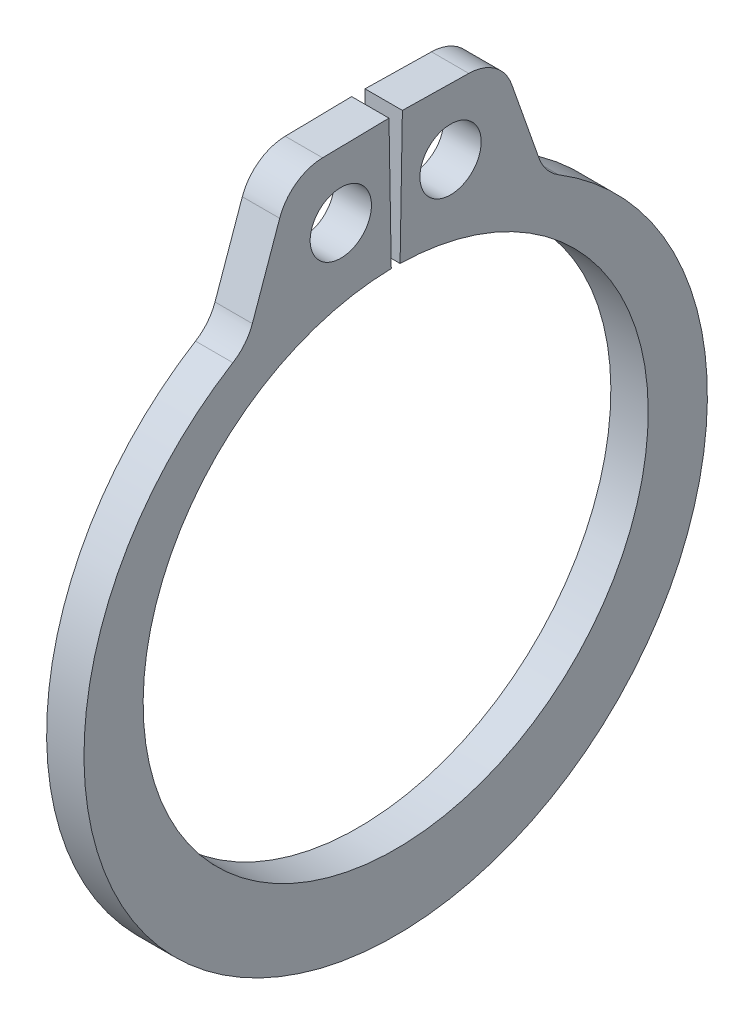
ISO-10303-21;
HEADER;
FILE_DESCRIPTION(('STEP AP214'),'2;1');
FILE_NAME('part.step','',(''),(''),'','','');
FILE_SCHEMA(('AUTOMOTIVE_DESIGN { 1 0 10303 214 1 1 1 1 }'));
ENDSEC;
DATA;
#1=APPLICATION_CONTEXT('core data for automotive mechanical design processes');
#2=APPLICATION_PROTOCOL_DEFINITION('international standard','automotive_design',2000,#1);
#3=PRODUCT_CONTEXT('',#1,'mechanical');
#4=PRODUCT('Part','Part','',(#3));
#5=PRODUCT_RELATED_PRODUCT_CATEGORY('part','',(#4));
#6=PRODUCT_DEFINITION_FORMATION('','',#4);
#7=PRODUCT_DEFINITION_CONTEXT('part definition',#1,'design');
#8=PRODUCT_DEFINITION('design','',#6,#7);
#9=PRODUCT_DEFINITION_SHAPE('','',#8);
#10=(LENGTH_UNIT() NAMED_UNIT(*) SI_UNIT(.MILLI.,.METRE.));
#11=(NAMED_UNIT(*) PLANE_ANGLE_UNIT() SI_UNIT($,.RADIAN.));
#12=(NAMED_UNIT(*) SI_UNIT($,.STERADIAN.) SOLID_ANGLE_UNIT());
#13=UNCERTAINTY_MEASURE_WITH_UNIT(LENGTH_MEASURE(1.E-05),#10,'distance_accuracy_value','');
#14=(GEOMETRIC_REPRESENTATION_CONTEXT(3) GLOBAL_UNCERTAINTY_ASSIGNED_CONTEXT((#13)) GLOBAL_UNIT_ASSIGNED_CONTEXT((#10,
#11,#12)) REPRESENTATION_CONTEXT('',''));
#15=CARTESIAN_POINT('',(0.,0.,0.));
#16=DIRECTION('',(0.,0.,1.));
#17=DIRECTION('',(1.,0.,0.));
#18=AXIS2_PLACEMENT_3D('',#15,#16,#17);
#19=CARTESIAN_POINT('',(0.3175,0.,0.));
#20=DIRECTION('',(1.,0.,0.));
#21=DIRECTION('',(0.,0.,-1.));
#22=AXIS2_PLACEMENT_3D('',#19,#20,#21);
#23=PLANE('',#22);
#24=CARTESIAN_POINT('',(0.3175,5.39474739325939,0.932493347387091));
#25=DIRECTION('',(1.,0.,0.));
#26=DIRECTION('',(0.,0.,-1.));
#27=AXIS2_PLACEMENT_3D('',#24,#25,#26);
#28=CIRCLE('',#27,0.5207);
#29=CARTESIAN_POINT('',(0.3175,5.39474739325939,0.411793347387091));
#30=VERTEX_POINT('',#29);
#31=EDGE_CURVE('E221',#30,#30,#28,.T.);
#32=ORIENTED_EDGE('',*,*,#31,.F.);
#33=EDGE_LOOP('',(#32));
#34=FACE_BOUND('',#33,.T.);
#35=DIRECTION('',(0.,-0.0174524064372937,0.999847695156391));
#36=VECTOR('',#35,1.);
#37=CARTESIAN_POINT('',(0.3175,6.5268057844419,0.1139258187413));
#38=LINE('',#37,#36);
#39=CARTESIAN_POINT('',(0.3175,6.5268057844419,0.1139258187413));
#40=VERTEX_POINT('',#39);
#41=CARTESIAN_POINT('',(0.3175,6.50710052961542,1.24283911167381));
#42=VERTEX_POINT('',#41);
#43=EDGE_CURVE('E133',#40,#42,#38,.T.);
#44=ORIENTED_EDGE('',*,*,#43,.T.);
#45=CARTESIAN_POINT('',(0.3175,5.71982045444928,1.22909708684509));
#46=DIRECTION('',(1.,0.,0.));
#47=DIRECTION('',(0.,0.,-1.));
#48=AXIS2_PLACEMENT_3D('',#45,#46,#47);
#49=CIRCLE('',#48,0.7874);
#50=CARTESIAN_POINT('',(0.3175,5.98129100900125,1.97181635352819));
#51=VERTEX_POINT('',#50);
#52=EDGE_CURVE('E174',#42,#51,#49,.T.);
#53=ORIENTED_EDGE('',*,*,#52,.T.);
#54=DIRECTION('',(0.,-0.94325535519825,0.332068268417539));
#55=VECTOR('',#54,1.);
#56=CARTESIAN_POINT('',(0.3175,6.49754857029042,1.79007049490147));
#57=LINE('',#56,#55);
#58=CARTESIAN_POINT('',(0.3175,4.66344515220105,2.4357573100223));
#59=VERTEX_POINT('',#58);
#60=EDGE_CURVE('E213',#51,#59,#57,.T.);
#61=ORIENTED_EDGE('',*,*,#60,.T.);
#62=CARTESIAN_POINT('',(0.3175,4.92491570675302,3.17847657670541));
#63=DIRECTION('',(1.,0.,0.));
#64=DIRECTION('',(0.,0.,-1.));
#65=AXIS2_PLACEMENT_3D('',#62,#63,#64);
#66=CIRCLE('',#65,0.7874);
#67=CARTESIAN_POINT('',(0.3175,4.25345366496523,2.76721329553605));
#68=VERTEX_POINT('',#67);
#69=EDGE_CURVE('E181',#59,#68,#66,.F.);
#70=ORIENTED_EDGE('',*,*,#69,.T.);
#71=CARTESIAN_POINT('',(0.3175,-0.26452490146511,0.));
#72=DIRECTION('',(1.,0.,0.));
#73=DIRECTION('',(0.,0.,-1.));
#74=AXIS2_PLACEMENT_3D('',#71,#72,#73);
#75=CIRCLE('',#74,5.29807509853489);
#76=CARTESIAN_POINT('',(0.3175,4.25345366496523,-2.76721329553605));
#77=VERTEX_POINT('',#76);
#78=EDGE_CURVE('E206',#68,#77,#75,.T.);
#79=ORIENTED_EDGE('',*,*,#78,.T.);
#80=CARTESIAN_POINT('',(0.3175,4.92491570675302,-3.17847657670541));
#81=DIRECTION('',(1.,0.,0.));
#82=DIRECTION('',(0.,0.,-1.));
#83=AXIS2_PLACEMENT_3D('',#80,#81,#82);
#84=CIRCLE('',#83,0.7874);
#85=CARTESIAN_POINT('',(0.3175,4.66344515220105,-2.4357573100223));
#86=VERTEX_POINT('',#85);
#87=EDGE_CURVE('E11',#77,#86,#84,.F.);
#88=ORIENTED_EDGE('',*,*,#87,.T.);
#89=DIRECTION('',(0.,0.94325535519825,0.332068268417539));
#90=VECTOR('',#89,1.);
#91=CARTESIAN_POINT('',(0.3175,6.49754857029042,-1.79007049490147));
#92=LINE('',#91,#90);
#93=CARTESIAN_POINT('',(0.3175,5.98129100900125,-1.97181635352819));
#94=VERTEX_POINT('',#93);
#95=EDGE_CURVE('E205',#86,#94,#92,.T.);
#96=ORIENTED_EDGE('',*,*,#95,.T.);
#97=CARTESIAN_POINT('',(0.3175,5.71982045444928,-1.22909708684509));
#98=DIRECTION('',(1.,0.,0.));
#99=DIRECTION('',(0.,0.,-1.));
#100=AXIS2_PLACEMENT_3D('',#97,#98,#99);
#101=CIRCLE('',#100,0.7874);
#102=CARTESIAN_POINT('',(0.3175,6.50710052961542,-1.24283911167381));
#103=VERTEX_POINT('',#102);
#104=EDGE_CURVE('E49',#94,#103,#101,.T.);
#105=ORIENTED_EDGE('',*,*,#104,.T.);
#106=DIRECTION('',(0.,0.0174524064372937,0.999847695156391));
#107=VECTOR('',#106,1.);
#108=CARTESIAN_POINT('',(0.3175,6.5268057844419,-0.1139258187413));
#109=LINE('',#108,#107);
#110=CARTESIAN_POINT('',(0.3175,6.5268057844419,-0.1139258187413));
#111=VERTEX_POINT('',#110);
#112=EDGE_CURVE('E210',#103,#111,#109,.T.);
#113=ORIENTED_EDGE('',*,*,#112,.T.);
#114=DIRECTION('',(0.,-0.999847695156391,0.0174524064372833));
#115=VECTOR('',#114,1.);
#116=CARTESIAN_POINT('',(0.3175,4.29194621622833,-0.0749161998726839));
#117=LINE('',#116,#115);
#118=CARTESIAN_POINT('',(0.3175,4.29194621622833,-0.0749161998726839));
#119=VERTEX_POINT('',#118);
#120=EDGE_CURVE('E139',#111,#119,#117,.T.);
#121=ORIENTED_EDGE('',*,*,#120,.T.);
#122=CARTESIAN_POINT('',(0.3175,0.,0.));
#123=DIRECTION('',(-1.,0.,0.));
#124=DIRECTION('',(0.,0.,-1.));
#125=AXIS2_PLACEMENT_3D('',#122,#123,#124);
#126=CIRCLE('',#125,4.29260000000001);
#127=CARTESIAN_POINT('',(0.3175,4.29194621622833,0.0749161998726839));
#128=VERTEX_POINT('',#127);
#129=EDGE_CURVE('E134',#119,#128,#126,.T.);
#130=ORIENTED_EDGE('',*,*,#129,.T.);
#131=DIRECTION('',(0.,0.999847695156391,0.0174524064372833));
#132=VECTOR('',#131,1.);
#133=CARTESIAN_POINT('',(0.3175,4.29194621622833,0.0749161998726839));
#134=LINE('',#133,#132);
#135=EDGE_CURVE('E125',#128,#40,#134,.T.);
#136=ORIENTED_EDGE('',*,*,#135,.T.);
#137=EDGE_LOOP('',(#44,#53,#61,#70,#79,#88,#96,#105,#113,#121,#130,#136));
#138=FACE_BOUND('',#137,.T.);
#139=CARTESIAN_POINT('',(0.3175,5.39474739325939,-0.932493347387091));
#140=DIRECTION('',(1.,0.,0.));
#141=DIRECTION('',(0.,0.,-1.));
#142=AXIS2_PLACEMENT_3D('',#139,#140,#141);
#143=CIRCLE('',#142,0.5207);
#144=CARTESIAN_POINT('',(0.3175,5.39474739325939,-1.45319334738709));
#145=VERTEX_POINT('',#144);
#146=EDGE_CURVE('E247',#145,#145,#143,.T.);
#147=ORIENTED_EDGE('',*,*,#146,.F.);
#148=EDGE_LOOP('',(#147));
#149=FACE_BOUND('',#148,.T.);
#150=ADVANCED_FACE('F34',(#34,#138,#149),#23,.T.);
#151=CARTESIAN_POINT('',(-0.3175,0.,0.));
#152=DIRECTION('',(1.,0.,0.));
#153=DIRECTION('',(0.,0.,-1.));
#154=AXIS2_PLACEMENT_3D('',#151,#152,#153);
#155=PLANE('',#154);
#156=CARTESIAN_POINT('',(-0.3175,5.39474739325939,0.932493347387091));
#157=DIRECTION('',(1.,0.,0.));
#158=DIRECTION('',(0.,0.,-1.));
#159=AXIS2_PLACEMENT_3D('',#156,#157,#158);
#160=CIRCLE('',#159,0.5207);
#161=CARTESIAN_POINT('',(-0.3175,5.39474739325939,0.411793347387091));
#162=VERTEX_POINT('',#161);
#163=EDGE_CURVE('E244',#162,#162,#160,.T.);
#164=ORIENTED_EDGE('',*,*,#163,.T.);
#165=EDGE_LOOP('',(#164));
#166=FACE_BOUND('',#165,.T.);
#167=DIRECTION('',(0.,-0.94325535519825,0.332068268417539));
#168=VECTOR('',#167,1.);
#169=CARTESIAN_POINT('',(-0.3175,6.49754857029042,1.79007049490147));
#170=LINE('',#169,#168);
#171=CARTESIAN_POINT('',(-0.3175,5.98129100900125,1.97181635352819));
#172=VERTEX_POINT('',#171);
#173=CARTESIAN_POINT('',(-0.3175,4.66344515220105,2.4357573100223));
#174=VERTEX_POINT('',#173);
#175=EDGE_CURVE('E200',#172,#174,#170,.T.);
#176=ORIENTED_EDGE('',*,*,#175,.F.);
#177=CARTESIAN_POINT('',(-0.3175,5.71982045444928,1.22909708684509));
#178=DIRECTION('',(1.,0.,0.));
#179=DIRECTION('',(0.,0.,-1.));
#180=AXIS2_PLACEMENT_3D('',#177,#178,#179);
#181=CIRCLE('',#180,0.7874);
#182=CARTESIAN_POINT('',(-0.3175,6.50710052961542,1.24283911167381));
#183=VERTEX_POINT('',#182);
#184=EDGE_CURVE('E170',#172,#183,#181,.F.);
#185=ORIENTED_EDGE('',*,*,#184,.T.);
#186=DIRECTION('',(0.,-0.0174524064372937,0.999847695156391));
#187=VECTOR('',#186,1.);
#188=CARTESIAN_POINT('',(-0.3175,6.5268057844419,0.1139258187413));
#189=LINE('',#188,#187);
#190=CARTESIAN_POINT('',(-0.3175,6.5268057844419,0.1139258187413));
#191=VERTEX_POINT('',#190);
#192=EDGE_CURVE('E223',#191,#183,#189,.T.);
#193=ORIENTED_EDGE('',*,*,#192,.F.);
#194=DIRECTION('',(0.,0.999847695156391,0.0174524064372833));
#195=VECTOR('',#194,1.);
#196=CARTESIAN_POINT('',(-0.3175,4.29194621622833,0.0749161998726839));
#197=LINE('',#196,#195);
#198=CARTESIAN_POINT('',(-0.3175,4.29194621622833,0.0749161998726839));
#199=VERTEX_POINT('',#198);
#200=EDGE_CURVE('E220',#199,#191,#197,.T.);
#201=ORIENTED_EDGE('',*,*,#200,.F.);
#202=CARTESIAN_POINT('',(-0.3175,0.,0.));
#203=DIRECTION('',(-1.,0.,0.));
#204=DIRECTION('',(0.,0.,-1.));
#205=AXIS2_PLACEMENT_3D('',#202,#203,#204);
#206=CIRCLE('',#205,4.29260000000001);
#207=CARTESIAN_POINT('',(-0.3175,4.29194621622833,-0.0749161998726839));
#208=VERTEX_POINT('',#207);
#209=EDGE_CURVE('E147',#208,#199,#206,.T.);
#210=ORIENTED_EDGE('',*,*,#209,.F.);
#211=DIRECTION('',(0.,-0.999847695156391,0.0174524064372833));
#212=VECTOR('',#211,1.);
#213=CARTESIAN_POINT('',(-0.3175,4.29194621622833,-0.0749161998726839));
#214=LINE('',#213,#212);
#215=CARTESIAN_POINT('',(-0.3175,6.5268057844419,-0.1139258187413));
#216=VERTEX_POINT('',#215);
#217=EDGE_CURVE('E143',#216,#208,#214,.T.);
#218=ORIENTED_EDGE('',*,*,#217,.F.);
#219=DIRECTION('',(0.,0.0174524064372937,0.999847695156391));
#220=VECTOR('',#219,1.);
#221=CARTESIAN_POINT('',(-0.3175,6.5268057844419,-0.1139258187413));
#222=LINE('',#221,#220);
#223=CARTESIAN_POINT('',(-0.3175,6.50710052961542,-1.24283911167381));
#224=VERTEX_POINT('',#223);
#225=EDGE_CURVE('E228',#224,#216,#222,.T.);
#226=ORIENTED_EDGE('',*,*,#225,.F.);
#227=CARTESIAN_POINT('',(-0.3175,5.71982045444928,-1.22909708684509));
#228=DIRECTION('',(1.,0.,0.));
#229=DIRECTION('',(0.,0.,-1.));
#230=AXIS2_PLACEMENT_3D('',#227,#228,#229);
#231=CIRCLE('',#230,0.7874);
#232=CARTESIAN_POINT('',(-0.3175,5.98129100900125,-1.97181635352819));
#233=VERTEX_POINT('',#232);
#234=EDGE_CURVE('E168',#224,#233,#231,.F.);
#235=ORIENTED_EDGE('',*,*,#234,.T.);
#236=DIRECTION('',(0.,0.94325535519825,0.332068268417539));
#237=VECTOR('',#236,1.);
#238=CARTESIAN_POINT('',(-0.3175,6.49754857029042,-1.79007049490147));
#239=LINE('',#238,#237);
#240=CARTESIAN_POINT('',(-0.3175,4.66344515220105,-2.4357573100223));
#241=VERTEX_POINT('',#240);
#242=EDGE_CURVE('E191',#241,#233,#239,.T.);
#243=ORIENTED_EDGE('',*,*,#242,.F.);
#244=CARTESIAN_POINT('',(-0.3175,4.92491570675302,-3.17847657670541));
#245=DIRECTION('',(1.,0.,0.));
#246=DIRECTION('',(0.,0.,-1.));
#247=AXIS2_PLACEMENT_3D('',#244,#245,#246);
#248=CIRCLE('',#247,0.7874);
#249=CARTESIAN_POINT('',(-0.3175,4.25345366496523,-2.76721329553605));
#250=VERTEX_POINT('',#249);
#251=EDGE_CURVE('E42',#241,#250,#248,.T.);
#252=ORIENTED_EDGE('',*,*,#251,.T.);
#253=CARTESIAN_POINT('',(-0.3175,-0.26452490146511,0.));
#254=DIRECTION('',(1.,0.,0.));
#255=DIRECTION('',(0.,0.,-1.));
#256=AXIS2_PLACEMENT_3D('',#253,#254,#255);
#257=CIRCLE('',#256,5.29807509853489);
#258=CARTESIAN_POINT('',(-0.3175,4.25345366496523,2.76721329553605));
#259=VERTEX_POINT('',#258);
#260=EDGE_CURVE('E189',#259,#250,#257,.T.);
#261=ORIENTED_EDGE('',*,*,#260,.F.);
#262=CARTESIAN_POINT('',(-0.3175,4.92491570675302,3.17847657670541));
#263=DIRECTION('',(1.,0.,0.));
#264=DIRECTION('',(0.,0.,-1.));
#265=AXIS2_PLACEMENT_3D('',#262,#263,#264);
#266=CIRCLE('',#265,0.7874);
#267=EDGE_CURVE('E179',#259,#174,#266,.T.);
#268=ORIENTED_EDGE('',*,*,#267,.T.);
#269=EDGE_LOOP('',(#176,#185,#193,#201,#210,#218,#226,#235,#243,#252,#261,#268));
#270=FACE_BOUND('',#269,.T.);
#271=CARTESIAN_POINT('',(-0.3175,5.39474739325939,-0.932493347387091));
#272=DIRECTION('',(1.,0.,0.));
#273=DIRECTION('',(0.,0.,-1.));
#274=AXIS2_PLACEMENT_3D('',#271,#272,#273);
#275=CIRCLE('',#274,0.5207);
#276=CARTESIAN_POINT('',(-0.3175,5.39474739325939,-1.45319334738709));
#277=VERTEX_POINT('',#276);
#278=EDGE_CURVE('E250',#277,#277,#275,.T.);
#279=ORIENTED_EDGE('',*,*,#278,.T.);
#280=EDGE_LOOP('',(#279));
#281=FACE_BOUND('',#280,.T.);
#282=ADVANCED_FACE('F187',(#166,#270,#281),#155,.F.);
#283=CARTESIAN_POINT('',(0.3175,0.,0.));
#284=DIRECTION('',(-1.,0.,0.));
#285=DIRECTION('',(0.,0.,1.));
#286=AXIS2_PLACEMENT_3D('',#283,#284,#285);
#287=CYLINDRICAL_SURFACE('',#286,4.29260000000001);
#288=ORIENTED_EDGE('',*,*,#209,.T.);
#289=DIRECTION('',(-1.,0.,0.));
#290=VECTOR('',#289,1.);
#291=CARTESIAN_POINT('',(0.3175,4.29194621622833,0.0749161998726839));
#292=LINE('',#291,#290);
#293=EDGE_CURVE('E129',#128,#199,#292,.T.);
#294=ORIENTED_EDGE('',*,*,#293,.F.);
#295=ORIENTED_EDGE('',*,*,#129,.F.);
#296=DIRECTION('',(-1.,0.,0.));
#297=VECTOR('',#296,1.);
#298=CARTESIAN_POINT('',(0.3175,4.29194621622833,-0.0749161998726839));
#299=LINE('',#298,#297);
#300=EDGE_CURVE('E218',#119,#208,#299,.T.);
#301=ORIENTED_EDGE('',*,*,#300,.T.);
#302=EDGE_LOOP('',(#288,#294,#295,#301));
#303=FACE_BOUND('',#302,.T.);
#304=ADVANCED_FACE('F145',(#303),#287,.F.);
#305=CARTESIAN_POINT('',(0.3175,4.29194621622833,0.0749161998726839));
#306=DIRECTION('',(0.,-0.0174524064372833,0.999847695156391));
#307=DIRECTION('',(0.,-0.999847695156391,-0.0174524064372833));
#308=AXIS2_PLACEMENT_3D('',#305,#306,#307);
#309=PLANE('',#308);
#310=ORIENTED_EDGE('',*,*,#200,.T.);
#311=DIRECTION('',(-1.,0.,0.));
#312=VECTOR('',#311,1.);
#313=CARTESIAN_POINT('',(0.3175,6.5268057844419,0.1139258187413));
#314=LINE('',#313,#312);
#315=EDGE_CURVE('E132',#40,#191,#314,.T.);
#316=ORIENTED_EDGE('',*,*,#315,.F.);
#317=ORIENTED_EDGE('',*,*,#135,.F.);
#318=ORIENTED_EDGE('',*,*,#293,.T.);
#319=EDGE_LOOP('',(#310,#316,#317,#318));
#320=FACE_BOUND('',#319,.T.);
#321=ADVANCED_FACE('F127',(#320),#309,.F.);
#322=CARTESIAN_POINT('',(0.3175,6.5268057844419,0.1139258187413));
#323=DIRECTION('',(0.,-0.999847695156391,-0.0174524064372937));
#324=DIRECTION('',(0.,0.0174524064372937,-0.999847695156391));
#325=AXIS2_PLACEMENT_3D('',#322,#323,#324);
#326=PLANE('',#325);
#327=ORIENTED_EDGE('',*,*,#192,.T.);
#328=DIRECTION('',(-1.,0.,0.));
#329=VECTOR('',#328,1.);
#330=CARTESIAN_POINT('',(0.3175,6.50710052961542,1.24283911167381));
#331=LINE('',#330,#329);
#332=EDGE_CURVE('E57',#183,#42,#331,.F.);
#333=ORIENTED_EDGE('',*,*,#332,.T.);
#334=ORIENTED_EDGE('',*,*,#43,.F.);
#335=ORIENTED_EDGE('',*,*,#315,.T.);
#336=EDGE_LOOP('',(#327,#333,#334,#335));
#337=FACE_BOUND('',#336,.T.);
#338=ADVANCED_FACE('F239',(#337),#326,.F.);
#339=CARTESIAN_POINT('',(0.3175,6.49754857029042,1.79007049490147));
#340=DIRECTION('',(0.,-0.332068268417539,-0.94325535519825));
#341=DIRECTION('',(0.,0.94325535519825,-0.332068268417539));
#342=AXIS2_PLACEMENT_3D('',#339,#340,#341);
#343=PLANE('',#342);
#344=ORIENTED_EDGE('',*,*,#175,.T.);
#345=DIRECTION('',(1.,0.,0.));
#346=VECTOR('',#345,1.);
#347=CARTESIAN_POINT('',(0.3175,4.66344515220105,2.4357573100223));
#348=LINE('',#347,#346);
#349=EDGE_CURVE('E161',#174,#59,#348,.T.);
#350=ORIENTED_EDGE('',*,*,#349,.T.);
#351=ORIENTED_EDGE('',*,*,#60,.F.);
#352=DIRECTION('',(-1.,0.,0.));
#353=VECTOR('',#352,1.);
#354=CARTESIAN_POINT('',(0.3175,5.98129100900125,1.97181635352819));
#355=LINE('',#354,#353);
#356=EDGE_CURVE('E158',#51,#172,#355,.T.);
#357=ORIENTED_EDGE('',*,*,#356,.T.);
#358=EDGE_LOOP('',(#344,#350,#351,#357));
#359=FACE_BOUND('',#358,.T.);
#360=ADVANCED_FACE('F280',(#359),#343,.F.);
#361=CARTESIAN_POINT('',(0.3175,-0.26452490146511,0.));
#362=DIRECTION('',(-1.,0.,0.));
#363=DIRECTION('',(0.,0.,1.));
#364=AXIS2_PLACEMENT_3D('',#361,#362,#363);
#365=CYLINDRICAL_SURFACE('',#364,5.29807509853489);
#366=ORIENTED_EDGE('',*,*,#78,.F.);
#367=DIRECTION('',(-1.,0.,0.));
#368=VECTOR('',#367,1.);
#369=CARTESIAN_POINT('',(0.3175,4.25345366496524,2.76721329553605));
#370=LINE('',#369,#368);
#371=EDGE_CURVE('E150',#68,#259,#370,.T.);
#372=ORIENTED_EDGE('',*,*,#371,.T.);
#373=ORIENTED_EDGE('',*,*,#260,.T.);
#374=DIRECTION('',(-1.,0.,0.));
#375=VECTOR('',#374,1.);
#376=CARTESIAN_POINT('',(0.3175,4.25345366496524,-2.76721329553605));
#377=LINE('',#376,#375);
#378=EDGE_CURVE('E148',#250,#77,#377,.F.);
#379=ORIENTED_EDGE('',*,*,#378,.T.);
#380=EDGE_LOOP('',(#366,#372,#373,#379));
#381=FACE_BOUND('',#380,.T.);
#382=ADVANCED_FACE('F197',(#381),#365,.T.);
#383=CARTESIAN_POINT('',(0.3175,6.49754857029042,-1.79007049490147));
#384=DIRECTION('',(0.,-0.332068268417539,0.94325535519825));
#385=DIRECTION('',(0.,-0.94325535519825,-0.332068268417539));
#386=AXIS2_PLACEMENT_3D('',#383,#384,#385);
#387=PLANE('',#386);
#388=ORIENTED_EDGE('',*,*,#95,.F.);
#389=DIRECTION('',(1.,0.,0.));
#390=VECTOR('',#389,1.);
#391=CARTESIAN_POINT('',(-0.3175,4.66344515220105,-2.4357573100223));
#392=LINE('',#391,#390);
#393=EDGE_CURVE('E165',#86,#241,#392,.F.);
#394=ORIENTED_EDGE('',*,*,#393,.T.);
#395=ORIENTED_EDGE('',*,*,#242,.T.);
#396=DIRECTION('',(-1.,0.,0.));
#397=VECTOR('',#396,1.);
#398=CARTESIAN_POINT('',(0.3175,5.98129100900125,-1.97181635352819));
#399=LINE('',#398,#397);
#400=EDGE_CURVE('E163',#233,#94,#399,.F.);
#401=ORIENTED_EDGE('',*,*,#400,.T.);
#402=EDGE_LOOP('',(#388,#394,#395,#401));
#403=FACE_BOUND('',#402,.T.);
#404=ADVANCED_FACE('F208',(#403),#387,.F.);
#405=CARTESIAN_POINT('',(0.3175,6.5268057844419,-0.1139258187413));
#406=DIRECTION('',(0.,-0.999847695156391,0.0174524064372937));
#407=DIRECTION('',(0.,-0.0174524064372937,-0.999847695156391));
#408=AXIS2_PLACEMENT_3D('',#405,#406,#407);
#409=PLANE('',#408);
#410=ORIENTED_EDGE('',*,*,#112,.F.);
#411=DIRECTION('',(-1.,0.,0.));
#412=VECTOR('',#411,1.);
#413=CARTESIAN_POINT('',(0.3175,6.50710052961542,-1.24283911167381));
#414=LINE('',#413,#412);
#415=EDGE_CURVE('E176',#103,#224,#414,.T.);
#416=ORIENTED_EDGE('',*,*,#415,.T.);
#417=ORIENTED_EDGE('',*,*,#225,.T.);
#418=DIRECTION('',(-1.,0.,0.));
#419=VECTOR('',#418,1.);
#420=CARTESIAN_POINT('',(0.3175,6.5268057844419,-0.1139258187413));
#421=LINE('',#420,#419);
#422=EDGE_CURVE('E152',#111,#216,#421,.T.);
#423=ORIENTED_EDGE('',*,*,#422,.F.);
#424=EDGE_LOOP('',(#410,#416,#417,#423));
#425=FACE_BOUND('',#424,.T.);
#426=ADVANCED_FACE('F273',(#425),#409,.F.);
#427=CARTESIAN_POINT('',(0.3175,4.29194621622833,-0.0749161998726839));
#428=DIRECTION('',(0.,-0.0174524064372833,-0.999847695156391));
#429=DIRECTION('',(0.,0.999847695156391,-0.0174524064372833));
#430=AXIS2_PLACEMENT_3D('',#427,#428,#429);
#431=PLANE('',#430);
#432=ORIENTED_EDGE('',*,*,#217,.T.);
#433=ORIENTED_EDGE('',*,*,#300,.F.);
#434=ORIENTED_EDGE('',*,*,#120,.F.);
#435=ORIENTED_EDGE('',*,*,#422,.T.);
#436=EDGE_LOOP('',(#432,#433,#434,#435));
#437=FACE_BOUND('',#436,.T.);
#438=ADVANCED_FACE('F235',(#437),#431,.F.);
#439=CARTESIAN_POINT('',(0.3175,5.39474739325939,0.932493347387091));
#440=DIRECTION('',(-1.,0.,0.));
#441=DIRECTION('',(0.,0.,1.));
#442=AXIS2_PLACEMENT_3D('',#439,#440,#441);
#443=CYLINDRICAL_SURFACE('',#442,0.5207);
#444=ORIENTED_EDGE('',*,*,#31,.T.);
#445=EDGE_LOOP('',(#444));
#446=FACE_BOUND('',#445,.T.);
#447=ORIENTED_EDGE('',*,*,#163,.F.);
#448=EDGE_LOOP('',(#447));
#449=FACE_BOUND('',#448,.T.);
#450=ADVANCED_FACE('F268',(#446,#449),#443,.F.);
#451=CARTESIAN_POINT('',(0.3175,5.39474739325939,-0.932493347387091));
#452=DIRECTION('',(-1.,0.,0.));
#453=DIRECTION('',(0.,0.,1.));
#454=AXIS2_PLACEMENT_3D('',#451,#452,#453);
#455=CYLINDRICAL_SURFACE('',#454,0.5207);
#456=ORIENTED_EDGE('',*,*,#146,.T.);
#457=EDGE_LOOP('',(#456));
#458=FACE_BOUND('',#457,.T.);
#459=ORIENTED_EDGE('',*,*,#278,.F.);
#460=EDGE_LOOP('',(#459));
#461=FACE_BOUND('',#460,.T.);
#462=ADVANCED_FACE('F256',(#458,#461),#455,.F.);
#463=CARTESIAN_POINT('',(0.3175,4.92491570675302,3.17847657670541));
#464=DIRECTION('',(-1.,0.,0.));
#465=DIRECTION('',(0.,0.,1.));
#466=AXIS2_PLACEMENT_3D('',#463,#464,#465);
#467=CYLINDRICAL_SURFACE('',#466,0.7874);
#468=ORIENTED_EDGE('',*,*,#69,.F.);
#469=ORIENTED_EDGE('',*,*,#349,.F.);
#470=ORIENTED_EDGE('',*,*,#267,.F.);
#471=ORIENTED_EDGE('',*,*,#371,.F.);
#472=EDGE_LOOP('',(#468,#469,#470,#471));
#473=FACE_BOUND('',#472,.T.);
#474=ADVANCED_FACE('F290',(#473),#467,.F.);
#475=CARTESIAN_POINT('',(0.3175,4.92491570675302,-3.17847657670541));
#476=DIRECTION('',(-1.,0.,0.));
#477=DIRECTION('',(0.,0.,1.));
#478=AXIS2_PLACEMENT_3D('',#475,#476,#477);
#479=CYLINDRICAL_SURFACE('',#478,0.7874);
#480=ORIENTED_EDGE('',*,*,#87,.F.);
#481=ORIENTED_EDGE('',*,*,#378,.F.);
#482=ORIENTED_EDGE('',*,*,#251,.F.);
#483=ORIENTED_EDGE('',*,*,#393,.F.);
#484=EDGE_LOOP('',(#480,#481,#482,#483));
#485=FACE_BOUND('',#484,.T.);
#486=ADVANCED_FACE('F203',(#485),#479,.F.);
#487=CARTESIAN_POINT('',(0.3175,5.71982045444928,1.22909708684509));
#488=DIRECTION('',(-1.,0.,0.));
#489=DIRECTION('',(0.,0.,1.));
#490=AXIS2_PLACEMENT_3D('',#487,#488,#489);
#491=CYLINDRICAL_SURFACE('',#490,0.7874);
#492=ORIENTED_EDGE('',*,*,#52,.F.);
#493=ORIENTED_EDGE('',*,*,#332,.F.);
#494=ORIENTED_EDGE('',*,*,#184,.F.);
#495=ORIENTED_EDGE('',*,*,#356,.F.);
#496=EDGE_LOOP('',(#492,#493,#494,#495));
#497=FACE_BOUND('',#496,.T.);
#498=ADVANCED_FACE('F295',(#497),#491,.T.);
#499=CARTESIAN_POINT('',(0.3175,5.71982045444928,-1.22909708684509));
#500=DIRECTION('',(-1.,0.,0.));
#501=DIRECTION('',(0.,0.,1.));
#502=AXIS2_PLACEMENT_3D('',#499,#500,#501);
#503=CYLINDRICAL_SURFACE('',#502,0.7874);
#504=ORIENTED_EDGE('',*,*,#104,.F.);
#505=ORIENTED_EDGE('',*,*,#400,.F.);
#506=ORIENTED_EDGE('',*,*,#234,.F.);
#507=ORIENTED_EDGE('',*,*,#415,.F.);
#508=EDGE_LOOP('',(#504,#505,#506,#507));
#509=FACE_BOUND('',#508,.T.);
#510=ADVANCED_FACE('F36',(#509),#503,.T.);
#511=CLOSED_SHELL('',(#150,#282,#304,#321,#338,#360,#382,#404,#426,#438,#450,#462,#474,#486,
#498,#510));
#512=MANIFOLD_SOLID_BREP('B2',#511);
#513=ADVANCED_BREP_SHAPE_REPRESENTATION('',(#18,#512),#14);
#514=SHAPE_DEFINITION_REPRESENTATION(#9,#513);
ENDSEC;
END-ISO-10303-21;
